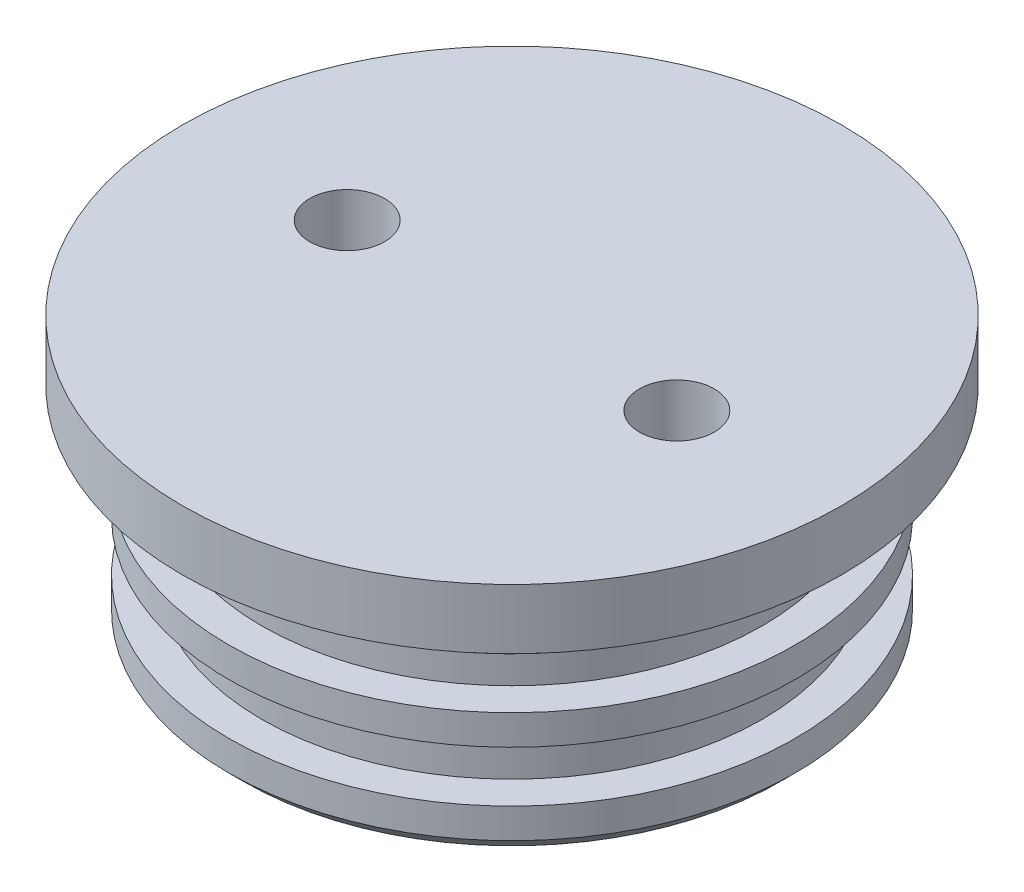
ISO-10303-21;
HEADER;
FILE_DESCRIPTION(('STEP AP214'),'2;1');
FILE_NAME('part.step','',(''),(''),'','','');
FILE_SCHEMA(('AUTOMOTIVE_DESIGN { 1 0 10303 214 1 1 1 1 }'));
ENDSEC;
DATA;
#1=APPLICATION_CONTEXT('core data for automotive mechanical design processes');
#2=APPLICATION_PROTOCOL_DEFINITION('international standard','automotive_design',2000,#1);
#3=PRODUCT_CONTEXT('',#1,'mechanical');
#4=PRODUCT('Part','Part','',(#3));
#5=PRODUCT_RELATED_PRODUCT_CATEGORY('part','',(#4));
#6=PRODUCT_DEFINITION_FORMATION('','',#4);
#7=PRODUCT_DEFINITION_CONTEXT('part definition',#1,'design');
#8=PRODUCT_DEFINITION('design','',#6,#7);
#9=PRODUCT_DEFINITION_SHAPE('','',#8);
#10=(LENGTH_UNIT() NAMED_UNIT(*) SI_UNIT(.MILLI.,.METRE.));
#11=(NAMED_UNIT(*) PLANE_ANGLE_UNIT() SI_UNIT($,.RADIAN.));
#12=(NAMED_UNIT(*) SI_UNIT($,.STERADIAN.) SOLID_ANGLE_UNIT());
#13=UNCERTAINTY_MEASURE_WITH_UNIT(LENGTH_MEASURE(1.E-05),#10,'distance_accuracy_value','');
#14=(GEOMETRIC_REPRESENTATION_CONTEXT(3) GLOBAL_UNCERTAINTY_ASSIGNED_CONTEXT((#13)) GLOBAL_UNIT_ASSIGNED_CONTEXT((#10,
#11,#12)) REPRESENTATION_CONTEXT('',''));
#15=CARTESIAN_POINT('',(0.,0.,0.));
#16=DIRECTION('',(0.,0.,1.));
#17=DIRECTION('',(1.,0.,0.));
#18=AXIS2_PLACEMENT_3D('',#15,#16,#17);
#19=CARTESIAN_POINT('',(5.5,0.,0.));
#20=DIRECTION('',(0.,1.,0.));
#21=DIRECTION('',(0.,0.,1.));
#22=AXIS2_PLACEMENT_3D('',#19,#20,#21);
#23=CYLINDRICAL_SURFACE('',#22,0.500000000000001);
#24=CARTESIAN_POINT('',(5.5,6.5,0.));
#25=DIRECTION('',(0.,1.,0.));
#26=DIRECTION('',(0.,0.,1.));
#27=AXIS2_PLACEMENT_3D('',#24,#25,#26);
#28=CIRCLE('',#27,0.500000000000001);
#29=CARTESIAN_POINT('',(5.5,6.5,0.500000000000001));
#30=VERTEX_POINT('',#29);
#31=EDGE_CURVE('E58',#30,#30,#28,.F.);
#32=ORIENTED_EDGE('',*,*,#31,.F.);
#33=EDGE_LOOP('',(#32));
#34=FACE_BOUND('',#33,.T.);
#35=CARTESIAN_POINT('',(5.5,1.5,0.));
#36=DIRECTION('',(0.,-1.,0.));
#37=DIRECTION('',(0.,0.,-1.));
#38=AXIS2_PLACEMENT_3D('',#35,#36,#37);
#39=CIRCLE('',#38,0.500000000000001);
#40=CARTESIAN_POINT('',(5.5,1.5,-0.500000000000001));
#41=VERTEX_POINT('',#40);
#42=EDGE_CURVE('E50',#41,#41,#39,.F.);
#43=ORIENTED_EDGE('',*,*,#42,.F.);
#44=EDGE_LOOP('',(#43));
#45=FACE_BOUND('',#44,.T.);
#46=ADVANCED_FACE('F32',(#34,#45),#23,.F.);
#47=CARTESIAN_POINT('',(-5.5,0.,0.));
#48=DIRECTION('',(0.,1.,0.));
#49=DIRECTION('',(0.,0.,1.));
#50=AXIS2_PLACEMENT_3D('',#47,#48,#49);
#51=CYLINDRICAL_SURFACE('',#50,0.500000000000001);
#52=CARTESIAN_POINT('',(-5.5,6.5,0.));
#53=DIRECTION('',(0.,1.,0.));
#54=DIRECTION('',(0.,0.,1.));
#55=AXIS2_PLACEMENT_3D('',#52,#53,#54);
#56=CIRCLE('',#55,0.500000000000001);
#57=CARTESIAN_POINT('',(-5.5,6.5,0.500000000000001));
#58=VERTEX_POINT('',#57);
#59=EDGE_CURVE('E62',#58,#58,#56,.F.);
#60=ORIENTED_EDGE('',*,*,#59,.F.);
#61=EDGE_LOOP('',(#60));
#62=FACE_BOUND('',#61,.T.);
#63=CARTESIAN_POINT('',(-5.5,1.5,0.));
#64=DIRECTION('',(0.,-1.,0.));
#65=DIRECTION('',(0.,0.,-1.));
#66=AXIS2_PLACEMENT_3D('',#63,#64,#65);
#67=CIRCLE('',#66,0.500000000000001);
#68=CARTESIAN_POINT('',(-5.5,1.5,-0.500000000000001));
#69=VERTEX_POINT('',#68);
#70=EDGE_CURVE('E54',#69,#69,#67,.F.);
#71=ORIENTED_EDGE('',*,*,#70,.F.);
#72=EDGE_LOOP('',(#71));
#73=FACE_BOUND('',#72,.T.);
#74=ADVANCED_FACE('F146',(#62,#73),#51,.F.);
#75=CARTESIAN_POINT('',(0.,7.,0.));
#76=DIRECTION('',(0.,-1.,0.));
#77=DIRECTION('',(0.,0.,-1.));
#78=AXIS2_PLACEMENT_3D('',#75,#76,#77);
#79=CYLINDRICAL_SURFACE('',#78,9.45);
#80=CARTESIAN_POINT('',(0.,7.,0.));
#81=DIRECTION('',(0.,-1.,0.));
#82=DIRECTION('',(0.,0.,-1.));
#83=AXIS2_PLACEMENT_3D('',#80,#81,#82);
#84=CIRCLE('',#83,9.45);
#85=CARTESIAN_POINT('',(0.,7.,-9.45));
#86=VERTEX_POINT('',#85);
#87=EDGE_CURVE('E69',#86,#86,#84,.T.);
#88=ORIENTED_EDGE('',*,*,#87,.T.);
#89=EDGE_LOOP('',(#88));
#90=FACE_BOUND('',#89,.T.);
#91=CARTESIAN_POINT('',(0.,5.9,0.));
#92=DIRECTION('',(0.,-1.,0.));
#93=DIRECTION('',(0.,0.,-1.));
#94=AXIS2_PLACEMENT_3D('',#91,#92,#93);
#95=CIRCLE('',#94,9.45);
#96=CARTESIAN_POINT('',(0.,5.9,-9.45));
#97=VERTEX_POINT('',#96);
#98=EDGE_CURVE('E66',#97,#97,#95,.F.);
#99=ORIENTED_EDGE('',*,*,#98,.T.);
#100=EDGE_LOOP('',(#99));
#101=FACE_BOUND('',#100,.T.);
#102=ADVANCED_FACE('F152',(#90,#101),#79,.T.);
#103=CARTESIAN_POINT('',(0.,0.499999999999995,0.));
#104=DIRECTION('',(0.,1.,0.));
#105=DIRECTION('',(0.,0.,1.));
#106=AXIS2_PLACEMENT_3D('',#103,#104,#105);
#107=CIRCLE('',#106,9.45);
#108=CARTESIAN_POINT('',(0.,0.499999999999995,9.45));
#109=VERTEX_POINT('',#108);
#110=EDGE_CURVE('E10',#109,#109,#107,.T.);
#111=ORIENTED_EDGE('',*,*,#110,.T.);
#112=EDGE_LOOP('',(#111));
#113=FACE_BOUND('',#112,.T.);
#114=CARTESIAN_POINT('',(0.,1.5,0.));
#115=DIRECTION('',(0.,1.,0.));
#116=DIRECTION('',(0.,0.,1.));
#117=AXIS2_PLACEMENT_3D('',#114,#115,#116);
#118=CIRCLE('',#117,9.45);
#119=CARTESIAN_POINT('',(0.,1.5,9.45));
#120=VERTEX_POINT('',#119);
#121=EDGE_CURVE('E76',#120,#120,#118,.F.);
#122=ORIENTED_EDGE('',*,*,#121,.T.);
#123=EDGE_LOOP('',(#122));
#124=FACE_BOUND('',#123,.T.);
#125=ADVANCED_FACE('F168',(#113,#124),#79,.T.);
#126=CARTESIAN_POINT('',(0.,9.,0.));
#127=DIRECTION('',(0.,-1.,0.));
#128=DIRECTION('',(0.,0.,-1.));
#129=AXIS2_PLACEMENT_3D('',#126,#127,#128);
#130=CYLINDRICAL_SURFACE('',#129,11.);
#131=CARTESIAN_POINT('',(0.,9.,0.));
#132=DIRECTION('',(0.,1.,0.));
#133=DIRECTION('',(0.,0.,1.));
#134=AXIS2_PLACEMENT_3D('',#131,#132,#133);
#135=CIRCLE('',#134,11.);
#136=CARTESIAN_POINT('',(0.,9.,11.));
#137=VERTEX_POINT('',#136);
#138=EDGE_CURVE('E43',#137,#137,#135,.T.);
#139=ORIENTED_EDGE('',*,*,#138,.F.);
#140=EDGE_LOOP('',(#139));
#141=FACE_BOUND('',#140,.T.);
#142=CARTESIAN_POINT('',(0.,7.,0.));
#143=DIRECTION('',(0.,-1.,0.));
#144=DIRECTION('',(0.,0.,-1.));
#145=AXIS2_PLACEMENT_3D('',#142,#143,#144);
#146=CIRCLE('',#145,11.);
#147=CARTESIAN_POINT('',(0.,7.,-11.));
#148=VERTEX_POINT('',#147);
#149=EDGE_CURVE('E47',#148,#148,#146,.T.);
#150=ORIENTED_EDGE('',*,*,#149,.F.);
#151=EDGE_LOOP('',(#150));
#152=FACE_BOUND('',#151,.T.);
#153=ADVANCED_FACE('F166',(#141,#152),#130,.T.);
#154=CARTESIAN_POINT('',(0.,0.,0.));
#155=DIRECTION('',(0.,1.,0.));
#156=DIRECTION('',(0.,0.,1.));
#157=AXIS2_PLACEMENT_3D('',#154,#155,#156);
#158=PLANE('',#157);
#159=CARTESIAN_POINT('',(0.,0.,0.));
#160=DIRECTION('',(0.,1.,0.));
#161=DIRECTION('',(0.,0.,1.));
#162=AXIS2_PLACEMENT_3D('',#159,#160,#161);
#163=CIRCLE('',#162,8.95000000000001);
#164=CARTESIAN_POINT('',(0.,0.,8.95000000000001));
#165=VERTEX_POINT('',#164);
#166=EDGE_CURVE('E39',#165,#165,#163,.F.);
#167=ORIENTED_EDGE('',*,*,#166,.T.);
#168=EDGE_LOOP('',(#167));
#169=FACE_BOUND('',#168,.T.);
#170=CARTESIAN_POINT('',(0.,0.,0.));
#171=DIRECTION('',(0.,-1.,0.));
#172=DIRECTION('',(0.,0.,-1.));
#173=AXIS2_PLACEMENT_3D('',#170,#171,#172);
#174=CIRCLE('',#173,4.);
#175=CARTESIAN_POINT('',(0.,0.,-4.));
#176=VERTEX_POINT('',#175);
#177=EDGE_CURVE('E119',#176,#176,#174,.T.);
#178=ORIENTED_EDGE('',*,*,#177,.F.);
#179=EDGE_LOOP('',(#178));
#180=FACE_BOUND('',#179,.T.);
#181=CARTESIAN_POINT('',(-5.5,0.,0.));
#182=DIRECTION('',(0.,-1.,0.));
#183=DIRECTION('',(0.,0.,-1.));
#184=AXIS2_PLACEMENT_3D('',#181,#182,#183);
#185=CIRCLE('',#184,1.25);
#186=CARTESIAN_POINT('',(-5.5,0.,-1.25));
#187=VERTEX_POINT('',#186);
#188=EDGE_CURVE('E114',#187,#187,#185,.T.);
#189=ORIENTED_EDGE('',*,*,#188,.F.);
#190=EDGE_LOOP('',(#189));
#191=FACE_BOUND('',#190,.T.);
#192=CARTESIAN_POINT('',(5.5,0.,0.));
#193=DIRECTION('',(0.,-1.,0.));
#194=DIRECTION('',(0.,0.,-1.));
#195=AXIS2_PLACEMENT_3D('',#192,#193,#194);
#196=CIRCLE('',#195,1.25);
#197=CARTESIAN_POINT('',(5.5,0.,-1.25));
#198=VERTEX_POINT('',#197);
#199=EDGE_CURVE('E107',#198,#198,#196,.T.);
#200=ORIENTED_EDGE('',*,*,#199,.F.);
#201=EDGE_LOOP('',(#200));
#202=FACE_BOUND('',#201,.T.);
#203=ADVANCED_FACE('F163',(#169,#180,#191,#202),#158,.F.);
#204=CARTESIAN_POINT('',(0.,9.,0.));
#205=DIRECTION('',(0.,1.,0.));
#206=DIRECTION('',(0.,0.,1.));
#207=AXIS2_PLACEMENT_3D('',#204,#205,#206);
#208=PLANE('',#207);
#209=CARTESIAN_POINT('',(-5.5,9.,0.));
#210=DIRECTION('',(0.,1.,0.));
#211=DIRECTION('',(0.,0.,1.));
#212=AXIS2_PLACEMENT_3D('',#209,#210,#211);
#213=CIRCLE('',#212,1.25);
#214=CARTESIAN_POINT('',(-5.5,9.,1.25));
#215=VERTEX_POINT('',#214);
#216=EDGE_CURVE('E102',#215,#215,#213,.T.);
#217=ORIENTED_EDGE('',*,*,#216,.F.);
#218=EDGE_LOOP('',(#217));
#219=FACE_BOUND('',#218,.T.);
#220=CARTESIAN_POINT('',(5.5,9.,0.));
#221=DIRECTION('',(0.,1.,0.));
#222=DIRECTION('',(0.,0.,1.));
#223=AXIS2_PLACEMENT_3D('',#220,#221,#222);
#224=CIRCLE('',#223,1.25);
#225=CARTESIAN_POINT('',(5.5,9.,1.25));
#226=VERTEX_POINT('',#225);
#227=EDGE_CURVE('E53',#226,#226,#224,.T.);
#228=ORIENTED_EDGE('',*,*,#227,.F.);
#229=EDGE_LOOP('',(#228));
#230=FACE_BOUND('',#229,.T.);
#231=ORIENTED_EDGE('',*,*,#138,.T.);
#232=EDGE_LOOP('',(#231));
#233=FACE_BOUND('',#232,.T.);
#234=ADVANCED_FACE('F159',(#219,#230,#233),#208,.T.);
#235=CARTESIAN_POINT('',(0.,7.,0.));
#236=DIRECTION('',(0.,-1.,0.));
#237=DIRECTION('',(0.,0.,-1.));
#238=AXIS2_PLACEMENT_3D('',#235,#236,#237);
#239=PLANE('',#238);
#240=ORIENTED_EDGE('',*,*,#87,.F.);
#241=EDGE_LOOP('',(#240));
#242=FACE_BOUND('',#241,.T.);
#243=ORIENTED_EDGE('',*,*,#149,.T.);
#244=EDGE_LOOP('',(#243));
#245=FACE_BOUND('',#244,.T.);
#246=ADVANCED_FACE('F162',(#242,#245),#239,.T.);
#247=CARTESIAN_POINT('',(0.,0.,0.));
#248=DIRECTION('',(0.,-1.,0.));
#249=DIRECTION('',(0.,0.,-1.));
#250=AXIS2_PLACEMENT_3D('',#247,#248,#249);
#251=CYLINDRICAL_SURFACE('',#250,8.35);
#252=CARTESIAN_POINT('',(0.,3.2,0.));
#253=DIRECTION('',(0.,-1.,0.));
#254=DIRECTION('',(0.,0.,-1.));
#255=AXIS2_PLACEMENT_3D('',#252,#253,#254);
#256=CIRCLE('',#255,8.35);
#257=CARTESIAN_POINT('',(0.,3.2,-8.35));
#258=VERTEX_POINT('',#257);
#259=EDGE_CURVE('E84',#258,#258,#256,.T.);
#260=ORIENTED_EDGE('',*,*,#259,.T.);
#261=EDGE_LOOP('',(#260));
#262=FACE_BOUND('',#261,.T.);
#263=CARTESIAN_POINT('',(0.,1.5,0.));
#264=DIRECTION('',(0.,-1.,0.));
#265=DIRECTION('',(0.,0.,-1.));
#266=AXIS2_PLACEMENT_3D('',#263,#264,#265);
#267=CIRCLE('',#266,8.35);
#268=CARTESIAN_POINT('',(0.,1.5,-8.35));
#269=VERTEX_POINT('',#268);
#270=EDGE_CURVE('E88',#269,#269,#267,.T.);
#271=ORIENTED_EDGE('',*,*,#270,.F.);
#272=EDGE_LOOP('',(#271));
#273=FACE_BOUND('',#272,.T.);
#274=ADVANCED_FACE('F180',(#262,#273),#251,.T.);
#275=CARTESIAN_POINT('',(-10.55,3.2,0.));
#276=DIRECTION('',(0.,-1.,0.));
#277=DIRECTION('',(0.,0.,-1.));
#278=AXIS2_PLACEMENT_3D('',#275,#276,#277);
#279=PLANE('',#278);
#280=CARTESIAN_POINT('',(0.,3.2,0.));
#281=DIRECTION('',(0.,-1.,0.));
#282=DIRECTION('',(0.,0.,-1.));
#283=AXIS2_PLACEMENT_3D('',#280,#281,#282);
#284=CIRCLE('',#283,9.45);
#285=CARTESIAN_POINT('',(0.,3.2,-9.45));
#286=VERTEX_POINT('',#285);
#287=EDGE_CURVE('E73',#286,#286,#284,.F.);
#288=ORIENTED_EDGE('',*,*,#287,.F.);
#289=EDGE_LOOP('',(#288));
#290=FACE_BOUND('',#289,.T.);
#291=ORIENTED_EDGE('',*,*,#259,.F.);
#292=EDGE_LOOP('',(#291));
#293=FACE_BOUND('',#292,.T.);
#294=ADVANCED_FACE('F185',(#290,#293),#279,.T.);
#295=CARTESIAN_POINT('',(-10.55,1.5,0.));
#296=DIRECTION('',(0.,1.,0.));
#297=DIRECTION('',(0.,0.,1.));
#298=AXIS2_PLACEMENT_3D('',#295,#296,#297);
#299=PLANE('',#298);
#300=ORIENTED_EDGE('',*,*,#121,.F.);
#301=EDGE_LOOP('',(#300));
#302=FACE_BOUND('',#301,.T.);
#303=ORIENTED_EDGE('',*,*,#270,.T.);
#304=EDGE_LOOP('',(#303));
#305=FACE_BOUND('',#304,.T.);
#306=ADVANCED_FACE('F194',(#302,#305),#299,.T.);
#307=ORIENTED_EDGE('',*,*,#287,.T.);
#308=EDGE_LOOP('',(#307));
#309=FACE_BOUND('',#308,.T.);
#310=CARTESIAN_POINT('',(0.,4.2,0.));
#311=DIRECTION('',(0.,1.,0.));
#312=DIRECTION('',(0.,0.,1.));
#313=AXIS2_PLACEMENT_3D('',#310,#311,#312);
#314=CIRCLE('',#313,9.45);
#315=CARTESIAN_POINT('',(0.,4.2,9.45));
#316=VERTEX_POINT('',#315);
#317=EDGE_CURVE('E70',#316,#316,#314,.F.);
#318=ORIENTED_EDGE('',*,*,#317,.T.);
#319=EDGE_LOOP('',(#318));
#320=FACE_BOUND('',#319,.T.);
#321=ADVANCED_FACE('F174',(#309,#320),#79,.T.);
#322=CARTESIAN_POINT('',(0.,0.,0.));
#323=DIRECTION('',(0.,-1.,0.));
#324=DIRECTION('',(0.,0.,-1.));
#325=AXIS2_PLACEMENT_3D('',#322,#323,#324);
#326=CYLINDRICAL_SURFACE('',#325,8.35);
#327=CARTESIAN_POINT('',(0.,5.9,0.));
#328=DIRECTION('',(0.,-1.,0.));
#329=DIRECTION('',(0.,0.,-1.));
#330=AXIS2_PLACEMENT_3D('',#327,#328,#329);
#331=CIRCLE('',#330,8.35);
#332=CARTESIAN_POINT('',(0.,5.9,-8.35));
#333=VERTEX_POINT('',#332);
#334=EDGE_CURVE('E79',#333,#333,#331,.T.);
#335=ORIENTED_EDGE('',*,*,#334,.T.);
#336=EDGE_LOOP('',(#335));
#337=FACE_BOUND('',#336,.T.);
#338=CARTESIAN_POINT('',(0.,4.2,0.));
#339=DIRECTION('',(0.,-1.,0.));
#340=DIRECTION('',(0.,0.,-1.));
#341=AXIS2_PLACEMENT_3D('',#338,#339,#340);
#342=CIRCLE('',#341,8.35);
#343=CARTESIAN_POINT('',(0.,4.2,-8.35));
#344=VERTEX_POINT('',#343);
#345=EDGE_CURVE('E87',#344,#344,#342,.T.);
#346=ORIENTED_EDGE('',*,*,#345,.F.);
#347=EDGE_LOOP('',(#346));
#348=FACE_BOUND('',#347,.T.);
#349=ADVANCED_FACE('F199',(#337,#348),#326,.T.);
#350=CARTESIAN_POINT('',(-10.55,5.9,0.));
#351=DIRECTION('',(0.,-1.,0.));
#352=DIRECTION('',(0.,0.,-1.));
#353=AXIS2_PLACEMENT_3D('',#350,#351,#352);
#354=PLANE('',#353);
#355=ORIENTED_EDGE('',*,*,#98,.F.);
#356=EDGE_LOOP('',(#355));
#357=FACE_BOUND('',#356,.T.);
#358=ORIENTED_EDGE('',*,*,#334,.F.);
#359=EDGE_LOOP('',(#358));
#360=FACE_BOUND('',#359,.T.);
#361=ADVANCED_FACE('F202',(#357,#360),#354,.T.);
#362=CARTESIAN_POINT('',(-10.55,4.2,0.));
#363=DIRECTION('',(0.,1.,0.));
#364=DIRECTION('',(0.,0.,1.));
#365=AXIS2_PLACEMENT_3D('',#362,#363,#364);
#366=PLANE('',#365);
#367=ORIENTED_EDGE('',*,*,#317,.F.);
#368=EDGE_LOOP('',(#367));
#369=FACE_BOUND('',#368,.T.);
#370=ORIENTED_EDGE('',*,*,#345,.T.);
#371=EDGE_LOOP('',(#370));
#372=FACE_BOUND('',#371,.T.);
#373=ADVANCED_FACE('F205',(#369,#372),#366,.T.);
#374=CARTESIAN_POINT('',(-5.5,6.5,0.));
#375=DIRECTION('',(0.,1.,0.));
#376=DIRECTION('',(0.,0.,1.));
#377=AXIS2_PLACEMENT_3D('',#374,#375,#376);
#378=PLANE('',#377);
#379=CARTESIAN_POINT('',(-5.5,6.5,0.));
#380=DIRECTION('',(0.,1.,0.));
#381=DIRECTION('',(0.,0.,1.));
#382=AXIS2_PLACEMENT_3D('',#379,#380,#381);
#383=CIRCLE('',#382,1.25);
#384=CARTESIAN_POINT('',(-5.5,6.5,1.25));
#385=VERTEX_POINT('',#384);
#386=EDGE_CURVE('E65',#385,#385,#383,.T.);
#387=ORIENTED_EDGE('',*,*,#386,.T.);
#388=EDGE_LOOP('',(#387));
#389=FACE_BOUND('',#388,.T.);
#390=ORIENTED_EDGE('',*,*,#59,.T.);
#391=EDGE_LOOP('',(#390));
#392=FACE_BOUND('',#391,.T.);
#393=ADVANCED_FACE('F208',(#389,#392),#378,.T.);
#394=CARTESIAN_POINT('',(-5.5,6.5,0.));
#395=DIRECTION('',(0.,1.,0.));
#396=DIRECTION('',(0.,0.,1.));
#397=AXIS2_PLACEMENT_3D('',#394,#395,#396);
#398=CYLINDRICAL_SURFACE('',#397,1.25);
#399=ORIENTED_EDGE('',*,*,#386,.F.);
#400=EDGE_LOOP('',(#399));
#401=FACE_BOUND('',#400,.T.);
#402=ORIENTED_EDGE('',*,*,#216,.T.);
#403=EDGE_LOOP('',(#402));
#404=FACE_BOUND('',#403,.T.);
#405=ADVANCED_FACE('F213',(#401,#404),#398,.F.);
#406=CARTESIAN_POINT('',(5.5,6.5,0.));
#407=DIRECTION('',(0.,1.,0.));
#408=DIRECTION('',(0.,0.,1.));
#409=AXIS2_PLACEMENT_3D('',#406,#407,#408);
#410=PLANE('',#409);
#411=CARTESIAN_POINT('',(5.5,6.5,0.));
#412=DIRECTION('',(0.,1.,0.));
#413=DIRECTION('',(0.,0.,1.));
#414=AXIS2_PLACEMENT_3D('',#411,#412,#413);
#415=CIRCLE('',#414,1.25);
#416=CARTESIAN_POINT('',(5.5,6.5,1.25));
#417=VERTEX_POINT('',#416);
#418=EDGE_CURVE('E99',#417,#417,#415,.T.);
#419=ORIENTED_EDGE('',*,*,#418,.T.);
#420=EDGE_LOOP('',(#419));
#421=FACE_BOUND('',#420,.T.);
#422=ORIENTED_EDGE('',*,*,#31,.T.);
#423=EDGE_LOOP('',(#422));
#424=FACE_BOUND('',#423,.T.);
#425=ADVANCED_FACE('F274',(#421,#424),#410,.T.);
#426=CARTESIAN_POINT('',(5.5,6.5,0.));
#427=DIRECTION('',(0.,1.,0.));
#428=DIRECTION('',(0.,0.,1.));
#429=AXIS2_PLACEMENT_3D('',#426,#427,#428);
#430=CYLINDRICAL_SURFACE('',#429,1.25);
#431=ORIENTED_EDGE('',*,*,#418,.F.);
#432=EDGE_LOOP('',(#431));
#433=FACE_BOUND('',#432,.T.);
#434=ORIENTED_EDGE('',*,*,#227,.T.);
#435=EDGE_LOOP('',(#434));
#436=FACE_BOUND('',#435,.T.);
#437=ADVANCED_FACE('F284',(#433,#436),#430,.F.);
#438=CARTESIAN_POINT('',(5.5,1.5,0.));
#439=DIRECTION('',(0.,-1.,0.));
#440=DIRECTION('',(0.,0.,-1.));
#441=AXIS2_PLACEMENT_3D('',#438,#439,#440);
#442=PLANE('',#441);
#443=CARTESIAN_POINT('',(5.5,1.5,0.));
#444=DIRECTION('',(0.,-1.,0.));
#445=DIRECTION('',(0.,0.,-1.));
#446=AXIS2_PLACEMENT_3D('',#443,#444,#445);
#447=CIRCLE('',#446,1.25);
#448=CARTESIAN_POINT('',(5.5,1.5,-1.25));
#449=VERTEX_POINT('',#448);
#450=EDGE_CURVE('E110',#449,#449,#447,.T.);
#451=ORIENTED_EDGE('',*,*,#450,.T.);
#452=EDGE_LOOP('',(#451));
#453=FACE_BOUND('',#452,.T.);
#454=ORIENTED_EDGE('',*,*,#42,.T.);
#455=EDGE_LOOP('',(#454));
#456=FACE_BOUND('',#455,.T.);
#457=ADVANCED_FACE('F293',(#453,#456),#442,.T.);
#458=CARTESIAN_POINT('',(5.5,1.5,0.));
#459=DIRECTION('',(0.,-1.,0.));
#460=DIRECTION('',(0.,0.,-1.));
#461=AXIS2_PLACEMENT_3D('',#458,#459,#460);
#462=CYLINDRICAL_SURFACE('',#461,1.25);
#463=ORIENTED_EDGE('',*,*,#450,.F.);
#464=EDGE_LOOP('',(#463));
#465=FACE_BOUND('',#464,.T.);
#466=ORIENTED_EDGE('',*,*,#199,.T.);
#467=EDGE_LOOP('',(#466));
#468=FACE_BOUND('',#467,.T.);
#469=ADVANCED_FACE('F314',(#465,#468),#462,.F.);
#470=CARTESIAN_POINT('',(-5.5,1.5,0.));
#471=DIRECTION('',(0.,-1.,0.));
#472=DIRECTION('',(0.,0.,-1.));
#473=AXIS2_PLACEMENT_3D('',#470,#471,#472);
#474=PLANE('',#473);
#475=CARTESIAN_POINT('',(-5.5,1.5,0.));
#476=DIRECTION('',(0.,-1.,0.));
#477=DIRECTION('',(0.,0.,-1.));
#478=AXIS2_PLACEMENT_3D('',#475,#476,#477);
#479=CIRCLE('',#478,1.25);
#480=CARTESIAN_POINT('',(-5.5,1.5,-1.25));
#481=VERTEX_POINT('',#480);
#482=EDGE_CURVE('E57',#481,#481,#479,.T.);
#483=ORIENTED_EDGE('',*,*,#482,.T.);
#484=EDGE_LOOP('',(#483));
#485=FACE_BOUND('',#484,.T.);
#486=ORIENTED_EDGE('',*,*,#70,.T.);
#487=EDGE_LOOP('',(#486));
#488=FACE_BOUND('',#487,.T.);
#489=ADVANCED_FACE('F324',(#485,#488),#474,.T.);
#490=CARTESIAN_POINT('',(-5.5,1.5,0.));
#491=DIRECTION('',(0.,-1.,0.));
#492=DIRECTION('',(0.,0.,-1.));
#493=AXIS2_PLACEMENT_3D('',#490,#491,#492);
#494=CYLINDRICAL_SURFACE('',#493,1.25);
#495=ORIENTED_EDGE('',*,*,#482,.F.);
#496=EDGE_LOOP('',(#495));
#497=FACE_BOUND('',#496,.T.);
#498=ORIENTED_EDGE('',*,*,#188,.T.);
#499=EDGE_LOOP('',(#498));
#500=FACE_BOUND('',#499,.T.);
#501=ADVANCED_FACE('F334',(#497,#500),#494,.F.);
#502=CARTESIAN_POINT('',(0.,2.,0.));
#503=DIRECTION('',(0.,-1.,0.));
#504=DIRECTION('',(0.,0.,-1.));
#505=AXIS2_PLACEMENT_3D('',#502,#503,#504);
#506=CYLINDRICAL_SURFACE('',#505,4.);
#507=CARTESIAN_POINT('',(0.,2.,0.));
#508=DIRECTION('',(0.,-1.,0.));
#509=DIRECTION('',(0.,0.,-1.));
#510=AXIS2_PLACEMENT_3D('',#507,#508,#509);
#511=CIRCLE('',#510,4.);
#512=CARTESIAN_POINT('',(0.,2.,-4.));
#513=VERTEX_POINT('',#512);
#514=EDGE_CURVE('E111',#513,#513,#511,.T.);
#515=ORIENTED_EDGE('',*,*,#514,.F.);
#516=EDGE_LOOP('',(#515));
#517=FACE_BOUND('',#516,.T.);
#518=ORIENTED_EDGE('',*,*,#177,.T.);
#519=EDGE_LOOP('',(#518));
#520=FACE_BOUND('',#519,.T.);
#521=ADVANCED_FACE('F344',(#517,#520),#506,.F.);
#522=CARTESIAN_POINT('',(0.,2.,0.));
#523=DIRECTION('',(0.,-1.,0.));
#524=DIRECTION('',(0.,0.,-1.));
#525=AXIS2_PLACEMENT_3D('',#522,#523,#524);
#526=PLANE('',#525);
#527=CARTESIAN_POINT('',(0.,2.,0.));
#528=DIRECTION('',(0.,-1.,0.));
#529=DIRECTION('',(0.,0.,-1.));
#530=AXIS2_PLACEMENT_3D('',#527,#528,#529);
#531=CIRCLE('',#530,3.);
#532=CARTESIAN_POINT('',(0.,2.,-3.));
#533=VERTEX_POINT('',#532);
#534=EDGE_CURVE('E122',#533,#533,#531,.F.);
#535=ORIENTED_EDGE('',*,*,#534,.T.);
#536=EDGE_LOOP('',(#535));
#537=FACE_BOUND('',#536,.T.);
#538=ORIENTED_EDGE('',*,*,#514,.T.);
#539=EDGE_LOOP('',(#538));
#540=FACE_BOUND('',#539,.T.);
#541=ADVANCED_FACE('F128',(#537,#540),#526,.T.);
#542=CARTESIAN_POINT('',(0.,7.,0.));
#543=DIRECTION('',(0.,-1.,0.));
#544=DIRECTION('',(0.,0.,-1.));
#545=AXIS2_PLACEMENT_3D('',#542,#543,#544);
#546=PLANE('',#545);
#547=CARTESIAN_POINT('',(0.,7.,0.));
#548=DIRECTION('',(0.,-1.,0.));
#549=DIRECTION('',(0.,0.,-1.));
#550=AXIS2_PLACEMENT_3D('',#547,#548,#549);
#551=CIRCLE('',#550,3.);
#552=CARTESIAN_POINT('',(0.,7.,-3.));
#553=VERTEX_POINT('',#552);
#554=EDGE_CURVE('E61',#553,#553,#551,.T.);
#555=ORIENTED_EDGE('',*,*,#554,.T.);
#556=EDGE_LOOP('',(#555));
#557=FACE_BOUND('',#556,.T.);
#558=ADVANCED_FACE('F133',(#557),#546,.T.);
#559=CARTESIAN_POINT('',(0.,7.,0.));
#560=DIRECTION('',(0.,-1.,0.));
#561=DIRECTION('',(0.,0.,-1.));
#562=AXIS2_PLACEMENT_3D('',#559,#560,#561);
#563=CYLINDRICAL_SURFACE('',#562,3.);
#564=ORIENTED_EDGE('',*,*,#554,.F.);
#565=EDGE_LOOP('',(#564));
#566=FACE_BOUND('',#565,.T.);
#567=ORIENTED_EDGE('',*,*,#534,.F.);
#568=EDGE_LOOP('',(#567));
#569=FACE_BOUND('',#568,.T.);
#570=ADVANCED_FACE('F131',(#566,#569),#563,.F.);
#571=CARTESIAN_POINT('',(0.,0.,0.));
#572=DIRECTION('',(0.,1.,0.));
#573=DIRECTION('',(0.,0.,1.));
#574=AXIS2_PLACEMENT_3D('',#571,#572,#573);
#575=CONICAL_SURFACE('',#574,8.95000000000001,0.785398163397443);
#576=ORIENTED_EDGE('',*,*,#110,.F.);
#577=EDGE_LOOP('',(#576));
#578=FACE_BOUND('',#577,.T.);
#579=ORIENTED_EDGE('',*,*,#166,.F.);
#580=EDGE_LOOP('',(#579));
#581=FACE_BOUND('',#580,.T.);
#582=ADVANCED_FACE('F34',(#578,#581),#575,.T.);
#583=CLOSED_SHELL('',(#46,#74,#102,#125,#153,#203,#234,#246,#274,#294,#306,#321,#349,#361,#373,
#393,#405,#425,#437,#457,#469,#489,#501,#521,#541,#558,#570,#582));
#584=MANIFOLD_SOLID_BREP('B2',#583);
#585=ADVANCED_BREP_SHAPE_REPRESENTATION('',(#18,#584),#14);
#586=SHAPE_DEFINITION_REPRESENTATION(#9,#585);
ENDSEC;
END-ISO-10303-21;
